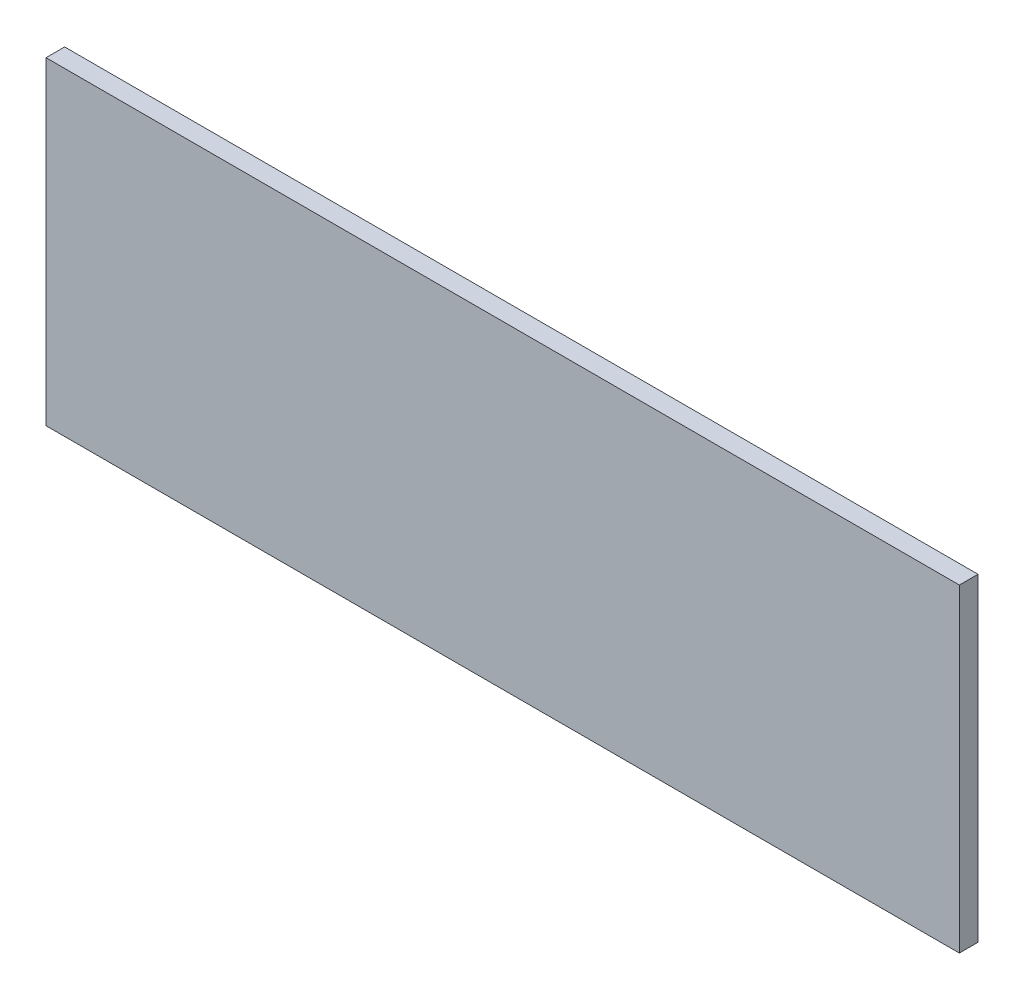
ISO-10303-21;
HEADER;
FILE_DESCRIPTION(('STEP AP214'),'2;1');
FILE_NAME('part.step','',(''),(''),'','','');
FILE_SCHEMA(('AUTOMOTIVE_DESIGN { 1 0 10303 214 1 1 1 1 }'));
ENDSEC;
DATA;
#1=APPLICATION_CONTEXT('core data for automotive mechanical design processes');
#2=APPLICATION_PROTOCOL_DEFINITION('international standard','automotive_design',2000,#1);
#3=PRODUCT_CONTEXT('',#1,'mechanical');
#4=PRODUCT('Part','Part','',(#3));
#5=PRODUCT_RELATED_PRODUCT_CATEGORY('part','',(#4));
#6=PRODUCT_DEFINITION_FORMATION('','',#4);
#7=PRODUCT_DEFINITION_CONTEXT('part definition',#1,'design');
#8=PRODUCT_DEFINITION('design','',#6,#7);
#9=PRODUCT_DEFINITION_SHAPE('','',#8);
#10=(LENGTH_UNIT() NAMED_UNIT(*) SI_UNIT(.MILLI.,.METRE.));
#11=(NAMED_UNIT(*) PLANE_ANGLE_UNIT() SI_UNIT($,.RADIAN.));
#12=(NAMED_UNIT(*) SI_UNIT($,.STERADIAN.) SOLID_ANGLE_UNIT());
#13=UNCERTAINTY_MEASURE_WITH_UNIT(LENGTH_MEASURE(1.E-05),#10,'distance_accuracy_value','');
#14=(GEOMETRIC_REPRESENTATION_CONTEXT(3) GLOBAL_UNCERTAINTY_ASSIGNED_CONTEXT((#13)) GLOBAL_UNIT_ASSIGNED_CONTEXT((#10,
#11,#12)) REPRESENTATION_CONTEXT('',''));
#15=CARTESIAN_POINT('',(0.,0.,0.));
#16=DIRECTION('',(0.,0.,1.));
#17=DIRECTION('',(1.,0.,0.));
#18=AXIS2_PLACEMENT_3D('',#15,#16,#17);
#19=CARTESIAN_POINT('',(-49.,-17.1,2.));
#20=DIRECTION('',(1.,0.,0.));
#21=DIRECTION('',(0.,0.,-1.));
#22=AXIS2_PLACEMENT_3D('',#19,#20,#21);
#23=PLANE('',#22);
#24=DIRECTION('',(0.,-1.,0.));
#25=VECTOR('',#24,1.);
#26=CARTESIAN_POINT('',(-49.,-17.1,0.));
#27=LINE('',#26,#25);
#28=CARTESIAN_POINT('',(-49.,17.1,0.));
#29=VERTEX_POINT('',#28);
#30=CARTESIAN_POINT('',(-49.,-17.1,0.));
#31=VERTEX_POINT('',#30);
#32=EDGE_CURVE('E113',#29,#31,#27,.T.);
#33=ORIENTED_EDGE('',*,*,#32,.T.);
#34=DIRECTION('',(0.,0.,-1.));
#35=VECTOR('',#34,1.);
#36=CARTESIAN_POINT('',(-49.,-17.1,2.));
#37=LINE('',#36,#35);
#38=CARTESIAN_POINT('',(-49.,-17.1,2.));
#39=VERTEX_POINT('',#38);
#40=EDGE_CURVE('E11',#39,#31,#37,.T.);
#41=ORIENTED_EDGE('',*,*,#40,.F.);
#42=DIRECTION('',(0.,-1.,0.));
#43=VECTOR('',#42,1.);
#44=CARTESIAN_POINT('',(-49.,-17.1,2.));
#45=LINE('',#44,#43);
#46=CARTESIAN_POINT('',(-49.,17.1,2.));
#47=VERTEX_POINT('',#46);
#48=EDGE_CURVE('E97',#47,#39,#45,.T.);
#49=ORIENTED_EDGE('',*,*,#48,.F.);
#50=DIRECTION('',(0.,0.,-1.));
#51=VECTOR('',#50,1.);
#52=CARTESIAN_POINT('',(-49.,17.1,2.));
#53=LINE('',#52,#51);
#54=EDGE_CURVE('E109',#47,#29,#53,.T.);
#55=ORIENTED_EDGE('',*,*,#54,.T.);
#56=EDGE_LOOP('',(#33,#41,#49,#55));
#57=FACE_BOUND('',#56,.T.);
#58=ADVANCED_FACE('F45',(#57),#23,.F.);
#59=CARTESIAN_POINT('',(-49.,-17.1,2.));
#60=DIRECTION('',(0.,1.,0.));
#61=DIRECTION('',(0.,0.,1.));
#62=AXIS2_PLACEMENT_3D('',#59,#60,#61);
#63=PLANE('',#62);
#64=DIRECTION('',(1.,0.,0.));
#65=VECTOR('',#64,1.);
#66=CARTESIAN_POINT('',(-49.,-17.1,0.));
#67=LINE('',#66,#65);
#68=CARTESIAN_POINT('',(49.,-17.1,0.));
#69=VERTEX_POINT('',#68);
#70=EDGE_CURVE('E102',#31,#69,#67,.T.);
#71=ORIENTED_EDGE('',*,*,#70,.T.);
#72=DIRECTION('',(0.,0.,-1.));
#73=VECTOR('',#72,1.);
#74=CARTESIAN_POINT('',(49.,-17.1,2.));
#75=LINE('',#74,#73);
#76=CARTESIAN_POINT('',(49.,-17.1,2.));
#77=VERTEX_POINT('',#76);
#78=EDGE_CURVE('E54',#77,#69,#75,.T.);
#79=ORIENTED_EDGE('',*,*,#78,.F.);
#80=DIRECTION('',(1.,0.,0.));
#81=VECTOR('',#80,1.);
#82=CARTESIAN_POINT('',(-49.,-17.1,2.));
#83=LINE('',#82,#81);
#84=EDGE_CURVE('E92',#39,#77,#83,.T.);
#85=ORIENTED_EDGE('',*,*,#84,.F.);
#86=ORIENTED_EDGE('',*,*,#40,.T.);
#87=EDGE_LOOP('',(#71,#79,#85,#86));
#88=FACE_BOUND('',#87,.T.);
#89=ADVANCED_FACE('F101',(#88),#63,.F.);
#90=CARTESIAN_POINT('',(49.,-17.1,2.));
#91=DIRECTION('',(-1.,0.,0.));
#92=DIRECTION('',(0.,0.,1.));
#93=AXIS2_PLACEMENT_3D('',#90,#91,#92);
#94=PLANE('',#93);
#95=DIRECTION('',(0.,1.,0.));
#96=VECTOR('',#95,1.);
#97=CARTESIAN_POINT('',(49.,-17.1,0.));
#98=LINE('',#97,#96);
#99=CARTESIAN_POINT('',(49.,17.1,0.));
#100=VERTEX_POINT('',#99);
#101=EDGE_CURVE('E79',#69,#100,#98,.T.);
#102=ORIENTED_EDGE('',*,*,#101,.T.);
#103=DIRECTION('',(0.,0.,-1.));
#104=VECTOR('',#103,1.);
#105=CARTESIAN_POINT('',(49.,17.1,2.));
#106=LINE('',#105,#104);
#107=CARTESIAN_POINT('',(49.,17.1,2.));
#108=VERTEX_POINT('',#107);
#109=EDGE_CURVE('E104',#108,#100,#106,.T.);
#110=ORIENTED_EDGE('',*,*,#109,.F.);
#111=DIRECTION('',(0.,1.,0.));
#112=VECTOR('',#111,1.);
#113=CARTESIAN_POINT('',(49.,-17.1,2.));
#114=LINE('',#113,#112);
#115=EDGE_CURVE('E95',#77,#108,#114,.T.);
#116=ORIENTED_EDGE('',*,*,#115,.F.);
#117=ORIENTED_EDGE('',*,*,#78,.T.);
#118=EDGE_LOOP('',(#102,#110,#116,#117));
#119=FACE_BOUND('',#118,.T.);
#120=ADVANCED_FACE('F105',(#119),#94,.F.);
#121=CARTESIAN_POINT('',(-49.,17.1,2.));
#122=DIRECTION('',(0.,-1.,0.));
#123=DIRECTION('',(0.,0.,-1.));
#124=AXIS2_PLACEMENT_3D('',#121,#122,#123);
#125=PLANE('',#124);
#126=DIRECTION('',(-1.,0.,0.));
#127=VECTOR('',#126,1.);
#128=CARTESIAN_POINT('',(-49.,17.1,0.));
#129=LINE('',#128,#127);
#130=EDGE_CURVE('E85',#100,#29,#129,.T.);
#131=ORIENTED_EDGE('',*,*,#130,.T.);
#132=ORIENTED_EDGE('',*,*,#54,.F.);
#133=DIRECTION('',(-1.,0.,0.));
#134=VECTOR('',#133,1.);
#135=CARTESIAN_POINT('',(-49.,17.1,2.));
#136=LINE('',#135,#134);
#137=EDGE_CURVE('E62',#108,#47,#136,.T.);
#138=ORIENTED_EDGE('',*,*,#137,.F.);
#139=ORIENTED_EDGE('',*,*,#109,.T.);
#140=EDGE_LOOP('',(#131,#132,#138,#139));
#141=FACE_BOUND('',#140,.T.);
#142=ADVANCED_FACE('F126',(#141),#125,.F.);
#143=CARTESIAN_POINT('',(0.,0.,2.));
#144=DIRECTION('',(0.,0.,-1.));
#145=DIRECTION('',(-1.,0.,0.));
#146=AXIS2_PLACEMENT_3D('',#143,#144,#145);
#147=PLANE('',#146);
#148=ORIENTED_EDGE('',*,*,#48,.T.);
#149=ORIENTED_EDGE('',*,*,#84,.T.);
#150=ORIENTED_EDGE('',*,*,#115,.T.);
#151=ORIENTED_EDGE('',*,*,#137,.T.);
#152=EDGE_LOOP('',(#148,#149,#150,#151));
#153=FACE_BOUND('',#152,.T.);
#154=ADVANCED_FACE('F93',(#153),#147,.F.);
#155=CARTESIAN_POINT('',(0.,0.,0.));
#156=DIRECTION('',(0.,0.,-1.));
#157=DIRECTION('',(-1.,0.,0.));
#158=AXIS2_PLACEMENT_3D('',#155,#156,#157);
#159=PLANE('',#158);
#160=ORIENTED_EDGE('',*,*,#32,.F.);
#161=ORIENTED_EDGE('',*,*,#130,.F.);
#162=ORIENTED_EDGE('',*,*,#101,.F.);
#163=ORIENTED_EDGE('',*,*,#70,.F.);
#164=EDGE_LOOP('',(#160,#161,#162,#163));
#165=FACE_BOUND('',#164,.T.);
#166=ADVANCED_FACE('F129',(#165),#159,.T.);
#167=CLOSED_SHELL('',(#58,#89,#120,#142,#154,#166));
#168=MANIFOLD_SOLID_BREP('B2',#167);
#169=ADVANCED_BREP_SHAPE_REPRESENTATION('',(#18,#168),#14);
#170=SHAPE_DEFINITION_REPRESENTATION(#9,#169);
ENDSEC;
END-ISO-10303-21;
